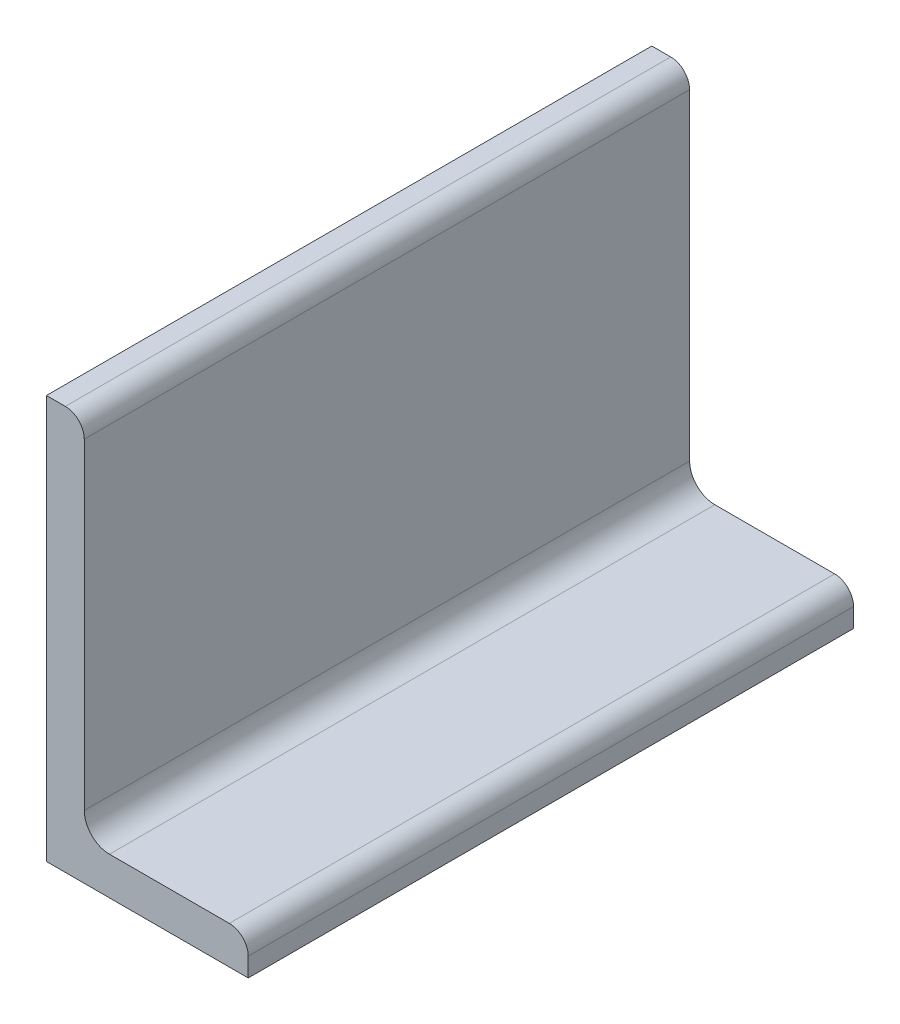
ISO-10303-21;
HEADER;
FILE_DESCRIPTION(('STEP AP214'),'2;1');
FILE_NAME('part.step','',(''),(''),'','','');
FILE_SCHEMA(('AUTOMOTIVE_DESIGN { 1 0 10303 214 1 1 1 1 }'));
ENDSEC;
DATA;
#1=APPLICATION_CONTEXT('core data for automotive mechanical design processes');
#2=APPLICATION_PROTOCOL_DEFINITION('international standard','automotive_design',2000,#1);
#3=PRODUCT_CONTEXT('',#1,'mechanical');
#4=PRODUCT('Part','Part','',(#3));
#5=PRODUCT_RELATED_PRODUCT_CATEGORY('part','',(#4));
#6=PRODUCT_DEFINITION_FORMATION('','',#4);
#7=PRODUCT_DEFINITION_CONTEXT('part definition',#1,'design');
#8=PRODUCT_DEFINITION('design','',#6,#7);
#9=PRODUCT_DEFINITION_SHAPE('','',#8);
#10=(LENGTH_UNIT() NAMED_UNIT(*) SI_UNIT(.MILLI.,.METRE.));
#11=(NAMED_UNIT(*) PLANE_ANGLE_UNIT() SI_UNIT($,.RADIAN.));
#12=(NAMED_UNIT(*) SI_UNIT($,.STERADIAN.) SOLID_ANGLE_UNIT());
#13=UNCERTAINTY_MEASURE_WITH_UNIT(LENGTH_MEASURE(1.E-05),#10,'distance_accuracy_value','');
#14=(GEOMETRIC_REPRESENTATION_CONTEXT(3) GLOBAL_UNCERTAINTY_ASSIGNED_CONTEXT((#13)) GLOBAL_UNIT_ASSIGNED_CONTEXT((#10,
#11,#12)) REPRESENTATION_CONTEXT('',''));
#15=CARTESIAN_POINT('',(0.,0.,0.));
#16=DIRECTION('',(0.,0.,1.));
#17=DIRECTION('',(1.,0.,0.));
#18=AXIS2_PLACEMENT_3D('',#15,#16,#17);
#19=CARTESIAN_POINT('',(0.865045893659089,203.678837479771,304.8));
#20=DIRECTION('',(1.,0.,0.));
#21=DIRECTION('',(0.,0.,-1.));
#22=AXIS2_PLACEMENT_3D('',#19,#20,#21);
#23=PLANE('',#22);
#24=DIRECTION('',(0.,-1.,0.));
#25=VECTOR('',#24,1.);
#26=CARTESIAN_POINT('',(0.865045893659089,203.678837479771,0.));
#27=LINE('',#26,#25);
#28=CARTESIAN_POINT('',(0.865045893659089,203.678837479771,0.));
#29=VERTEX_POINT('',#28);
#30=CARTESIAN_POINT('',(0.865045893659089,0.478837479771347,0.));
#31=VERTEX_POINT('',#30);
#32=EDGE_CURVE('E135',#29,#31,#27,.T.);
#33=ORIENTED_EDGE('',*,*,#32,.T.);
#34=DIRECTION('',(0.,0.,-1.));
#35=VECTOR('',#34,1.);
#36=CARTESIAN_POINT('',(0.865045893659089,0.478837479771347,304.8));
#37=LINE('',#36,#35);
#38=CARTESIAN_POINT('',(0.865045893659089,0.478837479771347,304.8));
#39=VERTEX_POINT('',#38);
#40=EDGE_CURVE('E11',#39,#31,#37,.T.);
#41=ORIENTED_EDGE('',*,*,#40,.F.);
#42=DIRECTION('',(0.,-1.,0.));
#43=VECTOR('',#42,1.);
#44=CARTESIAN_POINT('',(0.865045893659089,203.678837479771,304.8));
#45=LINE('',#44,#43);
#46=CARTESIAN_POINT('',(0.865045893659089,203.678837479771,304.8));
#47=VERTEX_POINT('',#46);
#48=EDGE_CURVE('E151',#47,#39,#45,.T.);
#49=ORIENTED_EDGE('',*,*,#48,.F.);
#50=DIRECTION('',(0.,0.,-1.));
#51=VECTOR('',#50,1.);
#52=CARTESIAN_POINT('',(0.865045893659089,203.678837479771,304.8));
#53=LINE('',#52,#51);
#54=EDGE_CURVE('E131',#47,#29,#53,.T.);
#55=ORIENTED_EDGE('',*,*,#54,.T.);
#56=EDGE_LOOP('',(#33,#41,#49,#55));
#57=FACE_BOUND('',#56,.T.);
#58=ADVANCED_FACE('F33',(#57),#23,.F.);
#59=CARTESIAN_POINT('',(0.865045893659089,0.478837479771347,304.8));
#60=DIRECTION('',(0.,1.,0.));
#61=DIRECTION('',(0.,0.,1.));
#62=AXIS2_PLACEMENT_3D('',#59,#60,#61);
#63=PLANE('',#62);
#64=DIRECTION('',(1.,0.,0.));
#65=VECTOR('',#64,1.);
#66=CARTESIAN_POINT('',(0.865045893659089,0.478837479771347,0.));
#67=LINE('',#66,#65);
#68=CARTESIAN_POINT('',(102.465045893659,0.478837479771347,0.));
#69=VERTEX_POINT('',#68);
#70=EDGE_CURVE('E138',#31,#69,#67,.T.);
#71=ORIENTED_EDGE('',*,*,#70,.T.);
#72=DIRECTION('',(0.,0.,-1.));
#73=VECTOR('',#72,1.);
#74=CARTESIAN_POINT('',(102.465045893659,0.478837479771347,304.8));
#75=LINE('',#74,#73);
#76=CARTESIAN_POINT('',(102.465045893659,0.478837479771347,304.8));
#77=VERTEX_POINT('',#76);
#78=EDGE_CURVE('E41',#77,#69,#75,.T.);
#79=ORIENTED_EDGE('',*,*,#78,.F.);
#80=DIRECTION('',(1.,0.,0.));
#81=VECTOR('',#80,1.);
#82=CARTESIAN_POINT('',(0.865045893659089,0.478837479771347,304.8));
#83=LINE('',#82,#81);
#84=EDGE_CURVE('E95',#39,#77,#83,.T.);
#85=ORIENTED_EDGE('',*,*,#84,.F.);
#86=ORIENTED_EDGE('',*,*,#40,.T.);
#87=EDGE_LOOP('',(#71,#79,#85,#86));
#88=FACE_BOUND('',#87,.T.);
#89=ADVANCED_FACE('F194',(#88),#63,.F.);
#90=CARTESIAN_POINT('',(102.465045893659,0.478837479771347,304.8));
#91=DIRECTION('',(-1.,0.,0.));
#92=DIRECTION('',(0.,0.,1.));
#93=AXIS2_PLACEMENT_3D('',#90,#91,#92);
#94=PLANE('',#93);
#95=DIRECTION('',(0.,1.,0.));
#96=VECTOR('',#95,1.);
#97=CARTESIAN_POINT('',(102.465045893659,0.478837479771347,0.));
#98=LINE('',#97,#96);
#99=CARTESIAN_POINT('',(102.465045893659,10.0038374797713,0.));
#100=VERTEX_POINT('',#99);
#101=EDGE_CURVE('E140',#69,#100,#98,.T.);
#102=ORIENTED_EDGE('',*,*,#101,.T.);
#103=DIRECTION('',(0.,0.,-1.));
#104=VECTOR('',#103,1.);
#105=CARTESIAN_POINT('',(102.465045893659,10.0038374797713,304.8));
#106=LINE('',#105,#104);
#107=CARTESIAN_POINT('',(102.465045893659,10.0038374797713,304.8));
#108=VERTEX_POINT('',#107);
#109=EDGE_CURVE('E161',#108,#100,#106,.T.);
#110=ORIENTED_EDGE('',*,*,#109,.F.);
#111=DIRECTION('',(0.,1.,0.));
#112=VECTOR('',#111,1.);
#113=CARTESIAN_POINT('',(102.465045893659,0.478837479771347,304.8));
#114=LINE('',#113,#112);
#115=EDGE_CURVE('E169',#77,#108,#114,.T.);
#116=ORIENTED_EDGE('',*,*,#115,.F.);
#117=ORIENTED_EDGE('',*,*,#78,.T.);
#118=EDGE_LOOP('',(#102,#110,#116,#117));
#119=FACE_BOUND('',#118,.T.);
#120=ADVANCED_FACE('F167',(#119),#94,.F.);
#121=CARTESIAN_POINT('',(92.9400458936591,10.0038374797713,304.8));
#122=DIRECTION('',(0.,0.,-1.));
#123=DIRECTION('',(-1.,0.,0.));
#124=AXIS2_PLACEMENT_3D('',#121,#122,#123);
#125=CYLINDRICAL_SURFACE('',#124,9.52500000000001);
#126=CARTESIAN_POINT('',(92.9400458936591,10.0038374797713,0.));
#127=DIRECTION('',(0.,0.,1.));
#128=DIRECTION('',(1.,0.,0.));
#129=AXIS2_PLACEMENT_3D('',#126,#127,#128);
#130=CIRCLE('',#129,9.52500000000001);
#131=CARTESIAN_POINT('',(92.9400458936591,19.5288374797714,0.));
#132=VERTEX_POINT('',#131);
#133=EDGE_CURVE('E142',#100,#132,#130,.T.);
#134=ORIENTED_EDGE('',*,*,#133,.T.);
#135=DIRECTION('',(0.,0.,-1.));
#136=VECTOR('',#135,1.);
#137=CARTESIAN_POINT('',(92.9400458936591,19.5288374797714,304.8));
#138=LINE('',#137,#136);
#139=CARTESIAN_POINT('',(92.9400458936591,19.5288374797714,304.8));
#140=VERTEX_POINT('',#139);
#141=EDGE_CURVE('E158',#140,#132,#138,.T.);
#142=ORIENTED_EDGE('',*,*,#141,.F.);
#143=CARTESIAN_POINT('',(92.9400458936591,10.0038374797713,304.8));
#144=DIRECTION('',(0.,0.,1.));
#145=DIRECTION('',(1.,0.,0.));
#146=AXIS2_PLACEMENT_3D('',#143,#144,#145);
#147=CIRCLE('',#146,9.52500000000001);
#148=EDGE_CURVE('E185',#108,#140,#147,.T.);
#149=ORIENTED_EDGE('',*,*,#148,.F.);
#150=ORIENTED_EDGE('',*,*,#109,.T.);
#151=EDGE_LOOP('',(#134,#142,#149,#150));
#152=FACE_BOUND('',#151,.T.);
#153=ADVANCED_FACE('F178',(#152),#125,.T.);
#154=CARTESIAN_POINT('',(92.9400458936591,19.5288374797713,304.8));
#155=DIRECTION('',(0.,-1.,0.));
#156=DIRECTION('',(0.,0.,-1.));
#157=AXIS2_PLACEMENT_3D('',#154,#155,#156);
#158=PLANE('',#157);
#159=DIRECTION('',(-1.,0.,0.));
#160=VECTOR('',#159,1.);
#161=CARTESIAN_POINT('',(92.9400458936591,19.5288374797713,0.));
#162=LINE('',#161,#160);
#163=CARTESIAN_POINT('',(32.6150458936591,19.5288374797713,0.));
#164=VERTEX_POINT('',#163);
#165=EDGE_CURVE('E144',#132,#164,#162,.T.);
#166=ORIENTED_EDGE('',*,*,#165,.T.);
#167=DIRECTION('',(0.,0.,-1.));
#168=VECTOR('',#167,1.);
#169=CARTESIAN_POINT('',(32.6150458936591,19.5288374797713,304.8));
#170=LINE('',#169,#168);
#171=CARTESIAN_POINT('',(32.6150458936591,19.5288374797713,304.8));
#172=VERTEX_POINT('',#171);
#173=EDGE_CURVE('E155',#172,#164,#170,.T.);
#174=ORIENTED_EDGE('',*,*,#173,.F.);
#175=DIRECTION('',(-1.,0.,0.));
#176=VECTOR('',#175,1.);
#177=CARTESIAN_POINT('',(92.9400458936591,19.5288374797713,304.8));
#178=LINE('',#177,#176);
#179=EDGE_CURVE('E184',#140,#172,#178,.T.);
#180=ORIENTED_EDGE('',*,*,#179,.F.);
#181=ORIENTED_EDGE('',*,*,#141,.T.);
#182=EDGE_LOOP('',(#166,#174,#180,#181));
#183=FACE_BOUND('',#182,.T.);
#184=ADVANCED_FACE('F182',(#183),#158,.F.);
#185=CARTESIAN_POINT('',(32.6150458936591,32.2288374797713,304.8));
#186=DIRECTION('',(0.,0.,-1.));
#187=DIRECTION('',(-1.,0.,0.));
#188=AXIS2_PLACEMENT_3D('',#185,#186,#187);
#189=CYLINDRICAL_SURFACE('',#188,12.7);
#190=CARTESIAN_POINT('',(32.6150458936591,32.2288374797713,0.));
#191=DIRECTION('',(0.,0.,-1.));
#192=DIRECTION('',(1.,0.,0.));
#193=AXIS2_PLACEMENT_3D('',#190,#191,#192);
#194=CIRCLE('',#193,12.7);
#195=CARTESIAN_POINT('',(19.9150458936591,32.2288374797713,0.));
#196=VERTEX_POINT('',#195);
#197=EDGE_CURVE('E146',#164,#196,#194,.T.);
#198=ORIENTED_EDGE('',*,*,#197,.T.);
#199=DIRECTION('',(0.,0.,-1.));
#200=VECTOR('',#199,1.);
#201=CARTESIAN_POINT('',(19.9150458936591,32.2288374797713,304.8));
#202=LINE('',#201,#200);
#203=CARTESIAN_POINT('',(19.9150458936591,32.2288374797713,304.8));
#204=VERTEX_POINT('',#203);
#205=EDGE_CURVE('E126',#204,#196,#202,.T.);
#206=ORIENTED_EDGE('',*,*,#205,.F.);
#207=CARTESIAN_POINT('',(32.6150458936591,32.2288374797713,304.8));
#208=DIRECTION('',(0.,0.,-1.));
#209=DIRECTION('',(1.,0.,0.));
#210=AXIS2_PLACEMENT_3D('',#207,#208,#209);
#211=CIRCLE('',#210,12.7);
#212=EDGE_CURVE('E117',#172,#204,#211,.T.);
#213=ORIENTED_EDGE('',*,*,#212,.F.);
#214=ORIENTED_EDGE('',*,*,#173,.T.);
#215=EDGE_LOOP('',(#198,#206,#213,#214));
#216=FACE_BOUND('',#215,.T.);
#217=ADVANCED_FACE('F206',(#216),#189,.F.);
#218=CARTESIAN_POINT('',(19.9150458936591,32.2288374797713,304.8));
#219=DIRECTION('',(-1.,0.,0.));
#220=DIRECTION('',(0.,0.,1.));
#221=AXIS2_PLACEMENT_3D('',#218,#219,#220);
#222=PLANE('',#221);
#223=DIRECTION('',(0.,1.,0.));
#224=VECTOR('',#223,1.);
#225=CARTESIAN_POINT('',(19.9150458936591,32.2288374797713,0.));
#226=LINE('',#225,#224);
#227=CARTESIAN_POINT('',(19.9150458936591,194.153837479771,0.));
#228=VERTEX_POINT('',#227);
#229=EDGE_CURVE('E125',#196,#228,#226,.T.);
#230=ORIENTED_EDGE('',*,*,#229,.T.);
#231=DIRECTION('',(0.,0.,-1.));
#232=VECTOR('',#231,1.);
#233=CARTESIAN_POINT('',(19.9150458936591,194.153837479771,304.8));
#234=LINE('',#233,#232);
#235=CARTESIAN_POINT('',(19.9150458936591,194.153837479771,304.8));
#236=VERTEX_POINT('',#235);
#237=EDGE_CURVE('E122',#236,#228,#234,.T.);
#238=ORIENTED_EDGE('',*,*,#237,.F.);
#239=DIRECTION('',(0.,1.,0.));
#240=VECTOR('',#239,1.);
#241=CARTESIAN_POINT('',(19.9150458936591,32.2288374797713,304.8));
#242=LINE('',#241,#240);
#243=EDGE_CURVE('E111',#204,#236,#242,.T.);
#244=ORIENTED_EDGE('',*,*,#243,.F.);
#245=ORIENTED_EDGE('',*,*,#205,.T.);
#246=EDGE_LOOP('',(#230,#238,#244,#245));
#247=FACE_BOUND('',#246,.T.);
#248=ADVANCED_FACE('F123',(#247),#222,.F.);
#249=CARTESIAN_POINT('',(10.3900458936591,194.153837479771,304.8));
#250=DIRECTION('',(0.,0.,-1.));
#251=DIRECTION('',(-1.,0.,0.));
#252=AXIS2_PLACEMENT_3D('',#249,#250,#251);
#253=CYLINDRICAL_SURFACE('',#252,9.52500000000001);
#254=CARTESIAN_POINT('',(10.3900458936591,194.153837479771,0.));
#255=DIRECTION('',(0.,0.,1.));
#256=DIRECTION('',(1.,0.,0.));
#257=AXIS2_PLACEMENT_3D('',#254,#255,#256);
#258=CIRCLE('',#257,9.52500000000001);
#259=CARTESIAN_POINT('',(10.3900458936591,203.678837479771,0.));
#260=VERTEX_POINT('',#259);
#261=EDGE_CURVE('E81',#228,#260,#258,.T.);
#262=ORIENTED_EDGE('',*,*,#261,.T.);
#263=DIRECTION('',(0.,0.,-1.));
#264=VECTOR('',#263,1.);
#265=CARTESIAN_POINT('',(10.3900458936591,203.678837479771,304.8));
#266=LINE('',#265,#264);
#267=CARTESIAN_POINT('',(10.3900458936591,203.678837479771,304.8));
#268=VERTEX_POINT('',#267);
#269=EDGE_CURVE('E127',#268,#260,#266,.T.);
#270=ORIENTED_EDGE('',*,*,#269,.F.);
#271=CARTESIAN_POINT('',(10.3900458936591,194.153837479771,304.8));
#272=DIRECTION('',(0.,0.,1.));
#273=DIRECTION('',(1.,0.,0.));
#274=AXIS2_PLACEMENT_3D('',#271,#272,#273);
#275=CIRCLE('',#274,9.52500000000001);
#276=EDGE_CURVE('E115',#236,#268,#275,.T.);
#277=ORIENTED_EDGE('',*,*,#276,.F.);
#278=ORIENTED_EDGE('',*,*,#237,.T.);
#279=EDGE_LOOP('',(#262,#270,#277,#278));
#280=FACE_BOUND('',#279,.T.);
#281=ADVANCED_FACE('F129',(#280),#253,.T.);
#282=CARTESIAN_POINT('',(10.3900458936591,203.678837479771,304.8));
#283=DIRECTION('',(0.,-1.,0.));
#284=DIRECTION('',(0.,0.,-1.));
#285=AXIS2_PLACEMENT_3D('',#282,#283,#284);
#286=PLANE('',#285);
#287=DIRECTION('',(-1.,0.,0.));
#288=VECTOR('',#287,1.);
#289=CARTESIAN_POINT('',(10.3900458936591,203.678837479771,0.));
#290=LINE('',#289,#288);
#291=EDGE_CURVE('E87',#260,#29,#290,.T.);
#292=ORIENTED_EDGE('',*,*,#291,.T.);
#293=ORIENTED_EDGE('',*,*,#54,.F.);
#294=DIRECTION('',(-1.,0.,0.));
#295=VECTOR('',#294,1.);
#296=CARTESIAN_POINT('',(10.3900458936591,203.678837479771,304.8));
#297=LINE('',#296,#295);
#298=EDGE_CURVE('E49',#268,#47,#297,.T.);
#299=ORIENTED_EDGE('',*,*,#298,.F.);
#300=ORIENTED_EDGE('',*,*,#269,.T.);
#301=EDGE_LOOP('',(#292,#293,#299,#300));
#302=FACE_BOUND('',#301,.T.);
#303=ADVANCED_FACE('F214',(#302),#286,.F.);
#304=CARTESIAN_POINT('',(92.9400458936591,10.0038374797713,304.8));
#305=DIRECTION('',(0.,0.,1.));
#306=DIRECTION('',(1.,0.,0.));
#307=AXIS2_PLACEMENT_3D('',#304,#305,#306);
#308=PLANE('',#307);
#309=ORIENTED_EDGE('',*,*,#48,.T.);
#310=ORIENTED_EDGE('',*,*,#84,.T.);
#311=ORIENTED_EDGE('',*,*,#115,.T.);
#312=ORIENTED_EDGE('',*,*,#148,.T.);
#313=ORIENTED_EDGE('',*,*,#179,.T.);
#314=ORIENTED_EDGE('',*,*,#212,.T.);
#315=ORIENTED_EDGE('',*,*,#243,.T.);
#316=ORIENTED_EDGE('',*,*,#276,.T.);
#317=ORIENTED_EDGE('',*,*,#298,.T.);
#318=EDGE_LOOP('',(#309,#310,#311,#312,#313,#314,#315,#316,#317));
#319=FACE_BOUND('',#318,.T.);
#320=ADVANCED_FACE('F113',(#319),#308,.T.);
#321=CARTESIAN_POINT('',(92.9400458936591,10.0038374797713,0.));
#322=DIRECTION('',(0.,0.,1.));
#323=DIRECTION('',(1.,0.,0.));
#324=AXIS2_PLACEMENT_3D('',#321,#322,#323);
#325=PLANE('',#324);
#326=ORIENTED_EDGE('',*,*,#32,.F.);
#327=ORIENTED_EDGE('',*,*,#291,.F.);
#328=ORIENTED_EDGE('',*,*,#261,.F.);
#329=ORIENTED_EDGE('',*,*,#229,.F.);
#330=ORIENTED_EDGE('',*,*,#197,.F.);
#331=ORIENTED_EDGE('',*,*,#165,.F.);
#332=ORIENTED_EDGE('',*,*,#133,.F.);
#333=ORIENTED_EDGE('',*,*,#101,.F.);
#334=ORIENTED_EDGE('',*,*,#70,.F.);
#335=EDGE_LOOP('',(#326,#327,#328,#329,#330,#331,#332,#333,#334));
#336=FACE_BOUND('',#335,.T.);
#337=ADVANCED_FACE('F173',(#336),#325,.F.);
#338=CLOSED_SHELL('',(#58,#89,#120,#153,#184,#217,#248,#281,#303,#320,#337));
#339=MANIFOLD_SOLID_BREP('B2',#338);
#340=ADVANCED_BREP_SHAPE_REPRESENTATION('',(#18,#339),#14);
#341=SHAPE_DEFINITION_REPRESENTATION(#9,#340);
ENDSEC;
END-ISO-10303-21;
